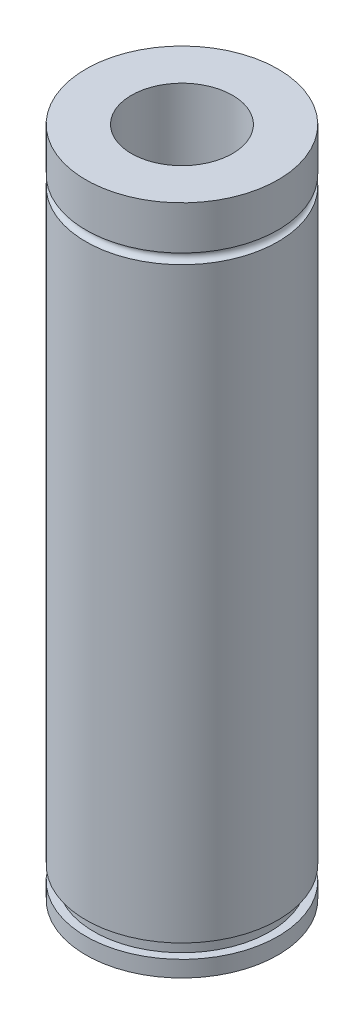
ISO-10303-21;
HEADER;
FILE_DESCRIPTION(('STEP AP214'),'2;1');
FILE_NAME('part.step','',(''),(''),'','','');
FILE_SCHEMA(('AUTOMOTIVE_DESIGN { 1 0 10303 214 1 1 1 1 }'));
ENDSEC;
DATA;
#1=APPLICATION_CONTEXT('core data for automotive mechanical design processes');
#2=APPLICATION_PROTOCOL_DEFINITION('international standard','automotive_design',2000,#1);
#3=PRODUCT_CONTEXT('',#1,'mechanical');
#4=PRODUCT('Part','Part','',(#3));
#5=PRODUCT_RELATED_PRODUCT_CATEGORY('part','',(#4));
#6=PRODUCT_DEFINITION_FORMATION('','',#4);
#7=PRODUCT_DEFINITION_CONTEXT('part definition',#1,'design');
#8=PRODUCT_DEFINITION('design','',#6,#7);
#9=PRODUCT_DEFINITION_SHAPE('','',#8);
#10=(LENGTH_UNIT() NAMED_UNIT(*) SI_UNIT(.MILLI.,.METRE.));
#11=(NAMED_UNIT(*) PLANE_ANGLE_UNIT() SI_UNIT($,.RADIAN.));
#12=(NAMED_UNIT(*) SI_UNIT($,.STERADIAN.) SOLID_ANGLE_UNIT());
#13=UNCERTAINTY_MEASURE_WITH_UNIT(LENGTH_MEASURE(1.E-05),#10,'distance_accuracy_value','');
#14=(GEOMETRIC_REPRESENTATION_CONTEXT(3) GLOBAL_UNCERTAINTY_ASSIGNED_CONTEXT((#13)) GLOBAL_UNIT_ASSIGNED_CONTEXT((#10,
#11,#12)) REPRESENTATION_CONTEXT('',''));
#15=CARTESIAN_POINT('',(0.,0.,0.));
#16=DIRECTION('',(0.,0.,1.));
#17=DIRECTION('',(1.,0.,0.));
#18=AXIS2_PLACEMENT_3D('',#15,#16,#17);
#19=CARTESIAN_POINT('',(0.,0.,0.));
#20=DIRECTION('',(0.,-1.,0.));
#21=DIRECTION('',(0.,0.,-1.));
#22=AXIS2_PLACEMENT_3D('',#19,#20,#21);
#23=PLANE('',#22);
#24=CARTESIAN_POINT('',(21.2132034355964,0.,21.2132034355964));
#25=DIRECTION('',(0.,-1.,0.));
#26=DIRECTION('',(0.,0.,-1.));
#27=AXIS2_PLACEMENT_3D('',#24,#25,#26);
#28=CIRCLE('',#27,4.025);
#29=CARTESIAN_POINT('',(21.2132034355964,0.,17.1882034355964));
#30=VERTEX_POINT('',#29);
#31=EDGE_CURVE('E75',#30,#30,#28,.T.);
#32=ORIENTED_EDGE('',*,*,#31,.F.);
#33=EDGE_LOOP('',(#32));
#34=FACE_BOUND('',#33,.T.);
#35=CARTESIAN_POINT('',(-21.2132034355964,0.,21.2132034355964));
#36=DIRECTION('',(0.,-1.,0.));
#37=DIRECTION('',(0.,0.,-1.));
#38=AXIS2_PLACEMENT_3D('',#35,#36,#37);
#39=CIRCLE('',#38,4.025);
#40=CARTESIAN_POINT('',(-21.2132034355964,0.,17.1882034355964));
#41=VERTEX_POINT('',#40);
#42=EDGE_CURVE('E68',#41,#41,#39,.T.);
#43=ORIENTED_EDGE('',*,*,#42,.F.);
#44=EDGE_LOOP('',(#43));
#45=FACE_BOUND('',#44,.T.);
#46=CARTESIAN_POINT('',(-21.2132034355964,0.,-21.2132034355964));
#47=DIRECTION('',(0.,-1.,0.));
#48=DIRECTION('',(0.,0.,-1.));
#49=AXIS2_PLACEMENT_3D('',#46,#47,#48);
#50=CIRCLE('',#49,4.025);
#51=CARTESIAN_POINT('',(-21.2132034355964,0.,-25.2382034355964));
#52=VERTEX_POINT('',#51);
#53=EDGE_CURVE('E84',#52,#52,#50,.T.);
#54=ORIENTED_EDGE('',*,*,#53,.F.);
#55=EDGE_LOOP('',(#54));
#56=FACE_BOUND('',#55,.T.);
#57=CARTESIAN_POINT('',(21.2132034355964,0.,-21.2132034355964));
#58=DIRECTION('',(0.,-1.,0.));
#59=DIRECTION('',(0.,0.,-1.));
#60=AXIS2_PLACEMENT_3D('',#57,#58,#59);
#61=CIRCLE('',#60,4.025);
#62=CARTESIAN_POINT('',(21.2132034355964,0.,-25.2382034355964));
#63=VERTEX_POINT('',#62);
#64=EDGE_CURVE('E93',#63,#63,#61,.T.);
#65=ORIENTED_EDGE('',*,*,#64,.F.);
#66=EDGE_LOOP('',(#65));
#67=FACE_BOUND('',#66,.T.);
#68=CARTESIAN_POINT('',(0.,0.,0.));
#69=DIRECTION('',(0.,-1.,0.));
#70=DIRECTION('',(0.,0.,-1.));
#71=AXIS2_PLACEMENT_3D('',#68,#69,#70);
#72=CIRCLE('',#71,47.5);
#73=CARTESIAN_POINT('',(0.,0.,-47.5));
#74=VERTEX_POINT('',#73);
#75=EDGE_CURVE('E11',#74,#74,#72,.T.);
#76=ORIENTED_EDGE('',*,*,#75,.T.);
#77=EDGE_LOOP('',(#76));
#78=FACE_BOUND('',#77,.T.);
#79=ADVANCED_FACE('F38',(#34,#45,#56,#67,#78),#23,.T.);
#80=CARTESIAN_POINT('',(0.,0.,0.));
#81=DIRECTION('',(0.,-1.,0.));
#82=DIRECTION('',(0.,0.,-1.));
#83=AXIS2_PLACEMENT_3D('',#80,#81,#82);
#84=CYLINDRICAL_SURFACE('',#83,47.5);
#85=CARTESIAN_POINT('',(0.,8.00000000000001,0.));
#86=DIRECTION('',(0.,-1.,0.));
#87=DIRECTION('',(0.,0.,-1.));
#88=AXIS2_PLACEMENT_3D('',#85,#86,#87);
#89=CIRCLE('',#88,47.5);
#90=CARTESIAN_POINT('',(0.,8.00000000000001,-47.5));
#91=VERTEX_POINT('',#90);
#92=EDGE_CURVE('E45',#91,#91,#89,.T.);
#93=ORIENTED_EDGE('',*,*,#92,.T.);
#94=EDGE_LOOP('',(#93));
#95=FACE_BOUND('',#94,.T.);
#96=ORIENTED_EDGE('',*,*,#75,.F.);
#97=EDGE_LOOP('',(#96));
#98=FACE_BOUND('',#97,.T.);
#99=ADVANCED_FACE('F128',(#95,#98),#84,.T.);
#100=CARTESIAN_POINT('',(47.5,8.,0.));
#101=DIRECTION('',(0.,1.,0.));
#102=DIRECTION('',(0.,0.,1.));
#103=AXIS2_PLACEMENT_3D('',#100,#101,#102);
#104=PLANE('',#103);
#105=CARTESIAN_POINT('',(0.,8.,0.));
#106=DIRECTION('',(0.,-1.,0.));
#107=DIRECTION('',(0.,0.,-1.));
#108=AXIS2_PLACEMENT_3D('',#105,#106,#107);
#109=CIRCLE('',#108,43.5);
#110=CARTESIAN_POINT('',(0.,8.,-43.5));
#111=VERTEX_POINT('',#110);
#112=EDGE_CURVE('E123',#111,#111,#109,.T.);
#113=ORIENTED_EDGE('',*,*,#112,.T.);
#114=EDGE_LOOP('',(#113));
#115=FACE_BOUND('',#114,.T.);
#116=ORIENTED_EDGE('',*,*,#92,.F.);
#117=EDGE_LOOP('',(#116));
#118=FACE_BOUND('',#117,.T.);
#119=ADVANCED_FACE('F131',(#115,#118),#104,.T.);
#120=CARTESIAN_POINT('',(0.,0.,0.));
#121=DIRECTION('',(0.,-1.,0.));
#122=DIRECTION('',(0.,0.,-1.));
#123=AXIS2_PLACEMENT_3D('',#120,#121,#122);
#124=CYLINDRICAL_SURFACE('',#123,43.5);
#125=CARTESIAN_POINT('',(0.,15.,0.));
#126=DIRECTION('',(0.,-1.,0.));
#127=DIRECTION('',(0.,0.,-1.));
#128=AXIS2_PLACEMENT_3D('',#125,#126,#127);
#129=CIRCLE('',#128,43.5);
#130=CARTESIAN_POINT('',(0.,15.,-43.5));
#131=VERTEX_POINT('',#130);
#132=EDGE_CURVE('E120',#131,#131,#129,.T.);
#133=ORIENTED_EDGE('',*,*,#132,.T.);
#134=EDGE_LOOP('',(#133));
#135=FACE_BOUND('',#134,.T.);
#136=ORIENTED_EDGE('',*,*,#112,.F.);
#137=EDGE_LOOP('',(#136));
#138=FACE_BOUND('',#137,.T.);
#139=ADVANCED_FACE('F133',(#135,#138),#124,.T.);
#140=CARTESIAN_POINT('',(43.5,15.,0.));
#141=DIRECTION('',(0.,-1.,0.));
#142=DIRECTION('',(0.,0.,-1.));
#143=AXIS2_PLACEMENT_3D('',#140,#141,#142);
#144=PLANE('',#143);
#145=CARTESIAN_POINT('',(0.,15.,0.));
#146=DIRECTION('',(0.,-1.,0.));
#147=DIRECTION('',(0.,0.,-1.));
#148=AXIS2_PLACEMENT_3D('',#145,#146,#147);
#149=CIRCLE('',#148,47.5);
#150=CARTESIAN_POINT('',(0.,15.,-47.5));
#151=VERTEX_POINT('',#150);
#152=EDGE_CURVE('E117',#151,#151,#149,.T.);
#153=ORIENTED_EDGE('',*,*,#152,.T.);
#154=EDGE_LOOP('',(#153));
#155=FACE_BOUND('',#154,.T.);
#156=ORIENTED_EDGE('',*,*,#132,.F.);
#157=EDGE_LOOP('',(#156));
#158=FACE_BOUND('',#157,.T.);
#159=ADVANCED_FACE('F140',(#155,#158),#144,.T.);
#160=CARTESIAN_POINT('',(0.,0.,0.));
#161=DIRECTION('',(0.,-1.,0.));
#162=DIRECTION('',(0.,0.,-1.));
#163=AXIS2_PLACEMENT_3D('',#160,#161,#162);
#164=CYLINDRICAL_SURFACE('',#163,47.5);
#165=CARTESIAN_POINT('',(0.,305.5,0.));
#166=DIRECTION('',(0.,-1.,0.));
#167=DIRECTION('',(0.,0.,-1.));
#168=AXIS2_PLACEMENT_3D('',#165,#166,#167);
#169=CIRCLE('',#168,47.5);
#170=CARTESIAN_POINT('',(0.,305.5,-47.5));
#171=VERTEX_POINT('',#170);
#172=EDGE_CURVE('E114',#171,#171,#169,.T.);
#173=ORIENTED_EDGE('',*,*,#172,.T.);
#174=EDGE_LOOP('',(#173));
#175=FACE_BOUND('',#174,.T.);
#176=ORIENTED_EDGE('',*,*,#152,.F.);
#177=EDGE_LOOP('',(#176));
#178=FACE_BOUND('',#177,.T.);
#179=ADVANCED_FACE('F197',(#175,#178),#164,.T.);
#180=CARTESIAN_POINT('',(0.,308.,0.));
#181=DIRECTION('',(0.,-1.,0.));
#182=DIRECTION('',(0.,0.,-1.));
#183=AXIS2_PLACEMENT_3D('',#180,#181,#182);
#184=TOROIDAL_SURFACE('',#183,47.5,2.5);
#185=CARTESIAN_POINT('',(0.,310.5,0.));
#186=DIRECTION('',(0.,-1.,0.));
#187=DIRECTION('',(0.,0.,-1.));
#188=AXIS2_PLACEMENT_3D('',#185,#186,#187);
#189=CIRCLE('',#188,47.5);
#190=CARTESIAN_POINT('',(0.,310.5,-47.5));
#191=VERTEX_POINT('',#190);
#192=EDGE_CURVE('E111',#191,#191,#189,.T.);
#193=ORIENTED_EDGE('',*,*,#192,.T.);
#194=EDGE_LOOP('',(#193));
#195=FACE_BOUND('',#194,.T.);
#196=ORIENTED_EDGE('',*,*,#172,.F.);
#197=EDGE_LOOP('',(#196));
#198=FACE_BOUND('',#197,.T.);
#199=ADVANCED_FACE('F193',(#195,#198),#184,.F.);
#200=CARTESIAN_POINT('',(0.,0.,0.));
#201=DIRECTION('',(0.,-1.,0.));
#202=DIRECTION('',(0.,0.,-1.));
#203=AXIS2_PLACEMENT_3D('',#200,#201,#202);
#204=CYLINDRICAL_SURFACE('',#203,47.5);
#205=CARTESIAN_POINT('',(0.,332.,0.));
#206=DIRECTION('',(0.,-1.,0.));
#207=DIRECTION('',(0.,0.,-1.));
#208=AXIS2_PLACEMENT_3D('',#205,#206,#207);
#209=CIRCLE('',#208,47.5);
#210=CARTESIAN_POINT('',(0.,332.,-47.5));
#211=VERTEX_POINT('',#210);
#212=EDGE_CURVE('E108',#211,#211,#209,.T.);
#213=ORIENTED_EDGE('',*,*,#212,.T.);
#214=EDGE_LOOP('',(#213));
#215=FACE_BOUND('',#214,.T.);
#216=ORIENTED_EDGE('',*,*,#192,.F.);
#217=EDGE_LOOP('',(#216));
#218=FACE_BOUND('',#217,.T.);
#219=ADVANCED_FACE('F189',(#215,#218),#204,.T.);
#220=CARTESIAN_POINT('',(47.5,332.,0.));
#221=DIRECTION('',(0.,1.,0.));
#222=DIRECTION('',(0.,0.,1.));
#223=AXIS2_PLACEMENT_3D('',#220,#221,#222);
#224=PLANE('',#223);
#225=CARTESIAN_POINT('',(0.,332.,0.));
#226=DIRECTION('',(0.,-1.,0.));
#227=DIRECTION('',(0.,0.,-1.));
#228=AXIS2_PLACEMENT_3D('',#225,#226,#227);
#229=CIRCLE('',#228,25.);
#230=CARTESIAN_POINT('',(0.,332.,-25.));
#231=VERTEX_POINT('',#230);
#232=EDGE_CURVE('E105',#231,#231,#229,.T.);
#233=ORIENTED_EDGE('',*,*,#232,.T.);
#234=EDGE_LOOP('',(#233));
#235=FACE_BOUND('',#234,.T.);
#236=ORIENTED_EDGE('',*,*,#212,.F.);
#237=EDGE_LOOP('',(#236));
#238=FACE_BOUND('',#237,.T.);
#239=ADVANCED_FACE('F185',(#235,#238),#224,.T.);
#240=CARTESIAN_POINT('',(0.,0.,0.));
#241=DIRECTION('',(0.,-1.,0.));
#242=DIRECTION('',(0.,0.,-1.));
#243=AXIS2_PLACEMENT_3D('',#240,#241,#242);
#244=CYLINDRICAL_SURFACE('',#243,25.);
#245=CARTESIAN_POINT('',(0.,82.,0.));
#246=DIRECTION('',(0.,-1.,0.));
#247=DIRECTION('',(0.,0.,-1.));
#248=AXIS2_PLACEMENT_3D('',#245,#246,#247);
#249=CIRCLE('',#248,25.);
#250=CARTESIAN_POINT('',(0.,82.,-25.));
#251=VERTEX_POINT('',#250);
#252=EDGE_CURVE('E102',#251,#251,#249,.T.);
#253=ORIENTED_EDGE('',*,*,#252,.T.);
#254=EDGE_LOOP('',(#253));
#255=FACE_BOUND('',#254,.T.);
#256=ORIENTED_EDGE('',*,*,#232,.F.);
#257=EDGE_LOOP('',(#256));
#258=FACE_BOUND('',#257,.T.);
#259=ADVANCED_FACE('F181',(#255,#258),#244,.F.);
#260=CARTESIAN_POINT('',(25.,82.,0.));
#261=DIRECTION('',(0.,1.,0.));
#262=DIRECTION('',(0.,0.,1.));
#263=AXIS2_PLACEMENT_3D('',#260,#261,#262);
#264=PLANE('',#263);
#265=ORIENTED_EDGE('',*,*,#252,.F.);
#266=EDGE_LOOP('',(#265));
#267=FACE_BOUND('',#266,.T.);
#268=ADVANCED_FACE('F178',(#267),#264,.T.);
#269=CARTESIAN_POINT('',(21.2132034355964,16.75,-21.2132034355964));
#270=DIRECTION('',(0.,-1.,0.));
#271=DIRECTION('',(0.,0.,-1.));
#272=AXIS2_PLACEMENT_3D('',#269,#270,#271);
#273=CONICAL_SURFACE('',#272,3.4,1.02974425867665);
#274=CARTESIAN_POINT('',(21.2132034355964,18.7929261046937,-21.2132034355964));
#275=VERTEX_POINT('',#274);
#276=VERTEX_LOOP('',#275);
#277=FACE_BOUND('',#276,.T.);
#278=CARTESIAN_POINT('',(21.2132034355964,16.75,-21.2132034355964));
#279=DIRECTION('',(0.,-1.,0.));
#280=DIRECTION('',(0.,0.,-1.));
#281=AXIS2_PLACEMENT_3D('',#278,#279,#280);
#282=CIRCLE('',#281,3.4);
#283=CARTESIAN_POINT('',(21.2132034355964,16.75,-24.6132034355964));
#284=VERTEX_POINT('',#283);
#285=EDGE_CURVE('E99',#284,#284,#282,.T.);
#286=ORIENTED_EDGE('',*,*,#285,.T.);
#287=EDGE_LOOP('',(#286));
#288=FACE_BOUND('',#287,.T.);
#289=ADVANCED_FACE('F170',(#277,#288),#273,.F.);
#290=CARTESIAN_POINT('',(21.2132034355964,0.,-21.2132034355964));
#291=DIRECTION('',(0.,-1.,0.));
#292=DIRECTION('',(0.,0.,-1.));
#293=AXIS2_PLACEMENT_3D('',#290,#291,#292);
#294=CYLINDRICAL_SURFACE('',#293,3.4);
#295=ORIENTED_EDGE('',*,*,#285,.F.);
#296=EDGE_LOOP('',(#295));
#297=FACE_BOUND('',#296,.T.);
#298=CARTESIAN_POINT('',(21.2132034355964,0.625000000000004,-21.2132034355964));
#299=DIRECTION('',(0.,-1.,0.));
#300=DIRECTION('',(0.,0.,-1.));
#301=AXIS2_PLACEMENT_3D('',#298,#299,#300);
#302=CIRCLE('',#301,3.4);
#303=CARTESIAN_POINT('',(21.2132034355964,0.625000000000004,-24.6132034355964));
#304=VERTEX_POINT('',#303);
#305=EDGE_CURVE('E96',#304,#304,#302,.T.);
#306=ORIENTED_EDGE('',*,*,#305,.T.);
#307=EDGE_LOOP('',(#306));
#308=FACE_BOUND('',#307,.T.);
#309=ADVANCED_FACE('F161',(#297,#308),#294,.F.);
#310=CARTESIAN_POINT('',(21.2132034355964,0.,-21.2132034355964));
#311=DIRECTION('',(0.,-1.,0.));
#312=DIRECTION('',(0.,0.,-1.));
#313=AXIS2_PLACEMENT_3D('',#310,#311,#312);
#314=CONICAL_SURFACE('',#313,4.025,0.785398163397447);
#315=ORIENTED_EDGE('',*,*,#305,.F.);
#316=EDGE_LOOP('',(#315));
#317=FACE_BOUND('',#316,.T.);
#318=ORIENTED_EDGE('',*,*,#64,.T.);
#319=EDGE_LOOP('',(#318));
#320=FACE_BOUND('',#319,.T.);
#321=ADVANCED_FACE('F158',(#317,#320),#314,.F.);
#322=CARTESIAN_POINT('',(-21.2132034355964,16.75,-21.2132034355964));
#323=DIRECTION('',(0.,-1.,0.));
#324=DIRECTION('',(0.,0.,-1.));
#325=AXIS2_PLACEMENT_3D('',#322,#323,#324);
#326=CONICAL_SURFACE('',#325,3.4,1.02974425867665);
#327=CARTESIAN_POINT('',(-21.2132034355964,18.7929261046937,-21.2132034355964));
#328=VERTEX_POINT('',#327);
#329=VERTEX_LOOP('',#328);
#330=FACE_BOUND('',#329,.T.);
#331=CARTESIAN_POINT('',(-21.2132034355964,16.75,-21.2132034355964));
#332=DIRECTION('',(0.,-1.,0.));
#333=DIRECTION('',(0.,0.,-1.));
#334=AXIS2_PLACEMENT_3D('',#331,#332,#333);
#335=CIRCLE('',#334,3.4);
#336=CARTESIAN_POINT('',(-21.2132034355964,16.75,-24.6132034355964));
#337=VERTEX_POINT('',#336);
#338=EDGE_CURVE('E90',#337,#337,#335,.T.);
#339=ORIENTED_EDGE('',*,*,#338,.T.);
#340=EDGE_LOOP('',(#339));
#341=FACE_BOUND('',#340,.T.);
#342=ADVANCED_FACE('F160',(#330,#341),#326,.F.);
#343=CARTESIAN_POINT('',(-21.2132034355964,0.,-21.2132034355964));
#344=DIRECTION('',(0.,-1.,0.));
#345=DIRECTION('',(0.,0.,-1.));
#346=AXIS2_PLACEMENT_3D('',#343,#344,#345);
#347=CYLINDRICAL_SURFACE('',#346,3.4);
#348=ORIENTED_EDGE('',*,*,#338,.F.);
#349=EDGE_LOOP('',(#348));
#350=FACE_BOUND('',#349,.T.);
#351=CARTESIAN_POINT('',(-21.2132034355964,0.625000000000004,-21.2132034355964));
#352=DIRECTION('',(0.,-1.,0.));
#353=DIRECTION('',(0.,0.,-1.));
#354=AXIS2_PLACEMENT_3D('',#351,#352,#353);
#355=CIRCLE('',#354,3.4);
#356=CARTESIAN_POINT('',(-21.2132034355964,0.625000000000004,-24.6132034355964));
#357=VERTEX_POINT('',#356);
#358=EDGE_CURVE('E87',#357,#357,#355,.T.);
#359=ORIENTED_EDGE('',*,*,#358,.T.);
#360=EDGE_LOOP('',(#359));
#361=FACE_BOUND('',#360,.T.);
#362=ADVANCED_FACE('F168',(#350,#361),#347,.F.);
#363=CARTESIAN_POINT('',(-21.2132034355964,0.,-21.2132034355964));
#364=DIRECTION('',(0.,-1.,0.));
#365=DIRECTION('',(0.,0.,-1.));
#366=AXIS2_PLACEMENT_3D('',#363,#364,#365);
#367=CONICAL_SURFACE('',#366,4.025,0.785398163397447);
#368=ORIENTED_EDGE('',*,*,#358,.F.);
#369=EDGE_LOOP('',(#368));
#370=FACE_BOUND('',#369,.T.);
#371=ORIENTED_EDGE('',*,*,#53,.T.);
#372=EDGE_LOOP('',(#371));
#373=FACE_BOUND('',#372,.T.);
#374=ADVANCED_FACE('F257',(#370,#373),#367,.F.);
#375=CARTESIAN_POINT('',(-21.2132034355964,16.75,21.2132034355964));
#376=DIRECTION('',(0.,-1.,0.));
#377=DIRECTION('',(0.,0.,-1.));
#378=AXIS2_PLACEMENT_3D('',#375,#376,#377);
#379=CONICAL_SURFACE('',#378,3.4,1.02974425867665);
#380=CARTESIAN_POINT('',(-21.2132034355964,18.7929261046937,21.2132034355964));
#381=VERTEX_POINT('',#380);
#382=VERTEX_LOOP('',#381);
#383=FACE_BOUND('',#382,.T.);
#384=CARTESIAN_POINT('',(-21.2132034355964,16.75,21.2132034355964));
#385=DIRECTION('',(0.,-1.,0.));
#386=DIRECTION('',(0.,0.,-1.));
#387=AXIS2_PLACEMENT_3D('',#384,#385,#386);
#388=CIRCLE('',#387,3.4);
#389=CARTESIAN_POINT('',(-21.2132034355964,16.75,17.8132034355964));
#390=VERTEX_POINT('',#389);
#391=EDGE_CURVE('E81',#390,#390,#388,.T.);
#392=ORIENTED_EDGE('',*,*,#391,.T.);
#393=EDGE_LOOP('',(#392));
#394=FACE_BOUND('',#393,.T.);
#395=ADVANCED_FACE('F268',(#383,#394),#379,.F.);
#396=CARTESIAN_POINT('',(-21.2132034355964,0.,21.2132034355964));
#397=DIRECTION('',(0.,-1.,0.));
#398=DIRECTION('',(0.,0.,-1.));
#399=AXIS2_PLACEMENT_3D('',#396,#397,#398);
#400=CYLINDRICAL_SURFACE('',#399,3.4);
#401=ORIENTED_EDGE('',*,*,#391,.F.);
#402=EDGE_LOOP('',(#401));
#403=FACE_BOUND('',#402,.T.);
#404=CARTESIAN_POINT('',(-21.2132034355964,0.625000000000004,21.2132034355964));
#405=DIRECTION('',(0.,-1.,0.));
#406=DIRECTION('',(0.,0.,-1.));
#407=AXIS2_PLACEMENT_3D('',#404,#405,#406);
#408=CIRCLE('',#407,3.4);
#409=CARTESIAN_POINT('',(-21.2132034355964,0.625000000000004,17.8132034355964));
#410=VERTEX_POINT('',#409);
#411=EDGE_CURVE('E72',#410,#410,#408,.T.);
#412=ORIENTED_EDGE('',*,*,#411,.T.);
#413=EDGE_LOOP('',(#412));
#414=FACE_BOUND('',#413,.T.);
#415=ADVANCED_FACE('F264',(#403,#414),#400,.F.);
#416=CARTESIAN_POINT('',(-21.2132034355964,0.,21.2132034355964));
#417=DIRECTION('',(0.,-1.,0.));
#418=DIRECTION('',(0.,0.,-1.));
#419=AXIS2_PLACEMENT_3D('',#416,#417,#418);
#420=CONICAL_SURFACE('',#419,4.025,0.785398163397447);
#421=ORIENTED_EDGE('',*,*,#411,.F.);
#422=EDGE_LOOP('',(#421));
#423=FACE_BOUND('',#422,.T.);
#424=ORIENTED_EDGE('',*,*,#42,.T.);
#425=EDGE_LOOP('',(#424));
#426=FACE_BOUND('',#425,.T.);
#427=ADVANCED_FACE('F62',(#423,#426),#420,.F.);
#428=CARTESIAN_POINT('',(21.2132034355964,16.75,21.2132034355964));
#429=DIRECTION('',(0.,-1.,0.));
#430=DIRECTION('',(0.,0.,-1.));
#431=AXIS2_PLACEMENT_3D('',#428,#429,#430);
#432=CONICAL_SURFACE('',#431,3.4,1.02974425867665);
#433=CARTESIAN_POINT('',(21.2132034355964,18.7929261046937,21.2132034355964));
#434=VERTEX_POINT('',#433);
#435=VERTEX_LOOP('',#434);
#436=FACE_BOUND('',#435,.T.);
#437=CARTESIAN_POINT('',(21.2132034355964,16.75,21.2132034355964));
#438=DIRECTION('',(0.,-1.,0.));
#439=DIRECTION('',(0.,0.,-1.));
#440=AXIS2_PLACEMENT_3D('',#437,#438,#439);
#441=CIRCLE('',#440,3.4);
#442=CARTESIAN_POINT('',(21.2132034355964,16.75,17.8132034355964));
#443=VERTEX_POINT('',#442);
#444=EDGE_CURVE('E66',#443,#443,#441,.T.);
#445=ORIENTED_EDGE('',*,*,#444,.T.);
#446=EDGE_LOOP('',(#445));
#447=FACE_BOUND('',#446,.T.);
#448=ADVANCED_FACE('F58',(#436,#447),#432,.F.);
#449=CARTESIAN_POINT('',(21.2132034355964,0.,21.2132034355964));
#450=DIRECTION('',(0.,-1.,0.));
#451=DIRECTION('',(0.,0.,-1.));
#452=AXIS2_PLACEMENT_3D('',#449,#450,#451);
#453=CYLINDRICAL_SURFACE('',#452,3.4);
#454=ORIENTED_EDGE('',*,*,#444,.F.);
#455=EDGE_LOOP('',(#454));
#456=FACE_BOUND('',#455,.T.);
#457=CARTESIAN_POINT('',(21.2132034355964,0.625000000000004,21.2132034355964));
#458=DIRECTION('',(0.,-1.,0.));
#459=DIRECTION('',(0.,0.,-1.));
#460=AXIS2_PLACEMENT_3D('',#457,#458,#459);
#461=CIRCLE('',#460,3.4);
#462=CARTESIAN_POINT('',(21.2132034355964,0.625000000000004,17.8132034355964));
#463=VERTEX_POINT('',#462);
#464=EDGE_CURVE('E69',#463,#463,#461,.T.);
#465=ORIENTED_EDGE('',*,*,#464,.T.);
#466=EDGE_LOOP('',(#465));
#467=FACE_BOUND('',#466,.T.);
#468=ADVANCED_FACE('F61',(#456,#467),#453,.F.);
#469=CARTESIAN_POINT('',(21.2132034355964,0.,21.2132034355964));
#470=DIRECTION('',(0.,-1.,0.));
#471=DIRECTION('',(0.,0.,-1.));
#472=AXIS2_PLACEMENT_3D('',#469,#470,#471);
#473=CONICAL_SURFACE('',#472,4.025,0.785398163397447);
#474=ORIENTED_EDGE('',*,*,#464,.F.);
#475=EDGE_LOOP('',(#474));
#476=FACE_BOUND('',#475,.T.);
#477=ORIENTED_EDGE('',*,*,#31,.T.);
#478=EDGE_LOOP('',(#477));
#479=FACE_BOUND('',#478,.T.);
#480=ADVANCED_FACE('F279',(#476,#479),#473,.F.);
#481=CLOSED_SHELL('',(#79,#99,#119,#139,#159,#179,#199,#219,#239,#259,#268,#289,#309,#321,#342,
#362,#374,#395,#415,#427,#448,#468,#480));
#482=MANIFOLD_SOLID_BREP('B2',#481);
#483=ADVANCED_BREP_SHAPE_REPRESENTATION('',(#18,#482),#14);
#484=SHAPE_DEFINITION_REPRESENTATION(#9,#483);
ENDSEC;
END-ISO-10303-21;
